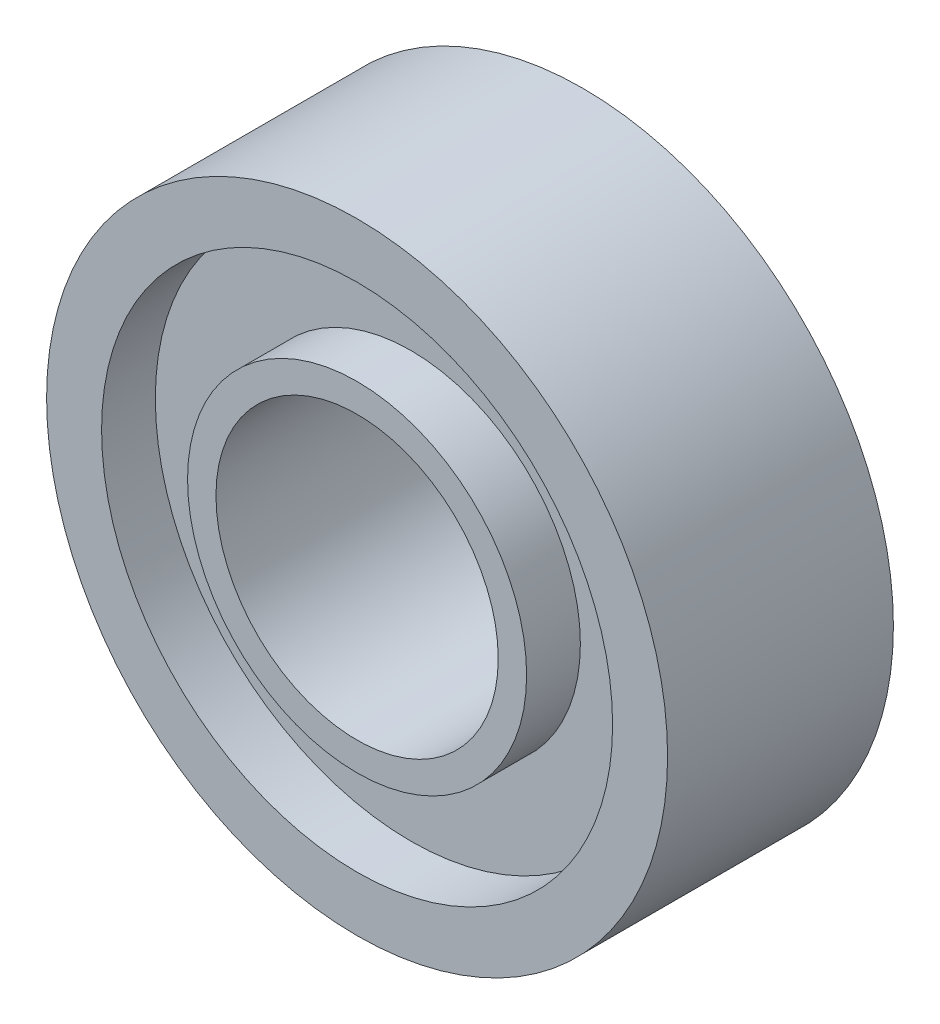
ISO-10303-21;
HEADER;
FILE_DESCRIPTION(('STEP AP214'),'2;1');
FILE_NAME('part.step','',(''),(''),'','','');
FILE_SCHEMA(('AUTOMOTIVE_DESIGN { 1 0 10303 214 1 1 1 1 }'));
ENDSEC;
DATA;
#1=APPLICATION_CONTEXT('core data for automotive mechanical design processes');
#2=APPLICATION_PROTOCOL_DEFINITION('international standard','automotive_design',2000,#1);
#3=PRODUCT_CONTEXT('',#1,'mechanical');
#4=PRODUCT('Part','Part','',(#3));
#5=PRODUCT_RELATED_PRODUCT_CATEGORY('part','',(#4));
#6=PRODUCT_DEFINITION_FORMATION('','',#4);
#7=PRODUCT_DEFINITION_CONTEXT('part definition',#1,'design');
#8=PRODUCT_DEFINITION('design','',#6,#7);
#9=PRODUCT_DEFINITION_SHAPE('','',#8);
#10=(LENGTH_UNIT() NAMED_UNIT(*) SI_UNIT(.MILLI.,.METRE.));
#11=(NAMED_UNIT(*) PLANE_ANGLE_UNIT() SI_UNIT($,.RADIAN.));
#12=(NAMED_UNIT(*) SI_UNIT($,.STERADIAN.) SOLID_ANGLE_UNIT());
#13=UNCERTAINTY_MEASURE_WITH_UNIT(LENGTH_MEASURE(1.E-05),#10,'distance_accuracy_value','');
#14=(GEOMETRIC_REPRESENTATION_CONTEXT(3) GLOBAL_UNCERTAINTY_ASSIGNED_CONTEXT((#13)) GLOBAL_UNIT_ASSIGNED_CONTEXT((#10,
#11,#12)) REPRESENTATION_CONTEXT('',''));
#15=CARTESIAN_POINT('',(0.,0.,0.));
#16=DIRECTION('',(0.,0.,1.));
#17=DIRECTION('',(1.,0.,0.));
#18=AXIS2_PLACEMENT_3D('',#15,#16,#17);
#19=CARTESIAN_POINT('',(0.,0.,2.));
#20=DIRECTION('',(0.,0.,1.));
#21=DIRECTION('',(1.,0.,0.));
#22=AXIS2_PLACEMENT_3D('',#19,#20,#21);
#23=PLANE('',#22);
#24=CARTESIAN_POINT('',(0.,0.,2.));
#25=DIRECTION('',(0.,0.,1.));
#26=DIRECTION('',(1.,0.,0.));
#27=AXIS2_PLACEMENT_3D('',#24,#25,#26);
#28=CIRCLE('',#27,2.5);
#29=CARTESIAN_POINT('',(2.5,0.,2.));
#30=VERTEX_POINT('',#29);
#31=EDGE_CURVE('E45',#30,#30,#28,.T.);
#32=ORIENTED_EDGE('',*,*,#31,.F.);
#33=EDGE_LOOP('',(#32));
#34=FACE_BOUND('',#33,.T.);
#35=CARTESIAN_POINT('',(0.,0.,2.));
#36=DIRECTION('',(0.,0.,1.));
#37=DIRECTION('',(1.,0.,0.));
#38=AXIS2_PLACEMENT_3D('',#35,#36,#37);
#39=CIRCLE('',#38,3.00299022562611);
#40=CARTESIAN_POINT('',(3.00299022562611,0.,2.));
#41=VERTEX_POINT('',#40);
#42=EDGE_CURVE('E62',#41,#41,#39,.T.);
#43=ORIENTED_EDGE('',*,*,#42,.T.);
#44=EDGE_LOOP('',(#43));
#45=FACE_BOUND('',#44,.T.);
#46=ADVANCED_FACE('F37',(#34,#45),#23,.T.);
#47=CARTESIAN_POINT('',(0.,0.,2.));
#48=DIRECTION('',(0.,0.,1.));
#49=DIRECTION('',(1.,0.,0.));
#50=AXIS2_PLACEMENT_3D('',#47,#48,#49);
#51=CIRCLE('',#50,4.52605772452427);
#52=CARTESIAN_POINT('',(4.52605772452427,0.,2.));
#53=VERTEX_POINT('',#52);
#54=EDGE_CURVE('E55',#53,#53,#51,.T.);
#55=ORIENTED_EDGE('',*,*,#54,.F.);
#56=EDGE_LOOP('',(#55));
#57=FACE_BOUND('',#56,.T.);
#58=CARTESIAN_POINT('',(0.,0.,2.));
#59=DIRECTION('',(0.,0.,1.));
#60=DIRECTION('',(1.,0.,0.));
#61=AXIS2_PLACEMENT_3D('',#58,#59,#60);
#62=CIRCLE('',#61,5.5);
#63=CARTESIAN_POINT('',(5.5,0.,2.));
#64=VERTEX_POINT('',#63);
#65=EDGE_CURVE('E10',#64,#64,#62,.T.);
#66=ORIENTED_EDGE('',*,*,#65,.T.);
#67=EDGE_LOOP('',(#66));
#68=FACE_BOUND('',#67,.T.);
#69=ADVANCED_FACE('F120',(#57,#68),#23,.T.);
#70=CARTESIAN_POINT('',(0.,0.,2.));
#71=DIRECTION('',(0.,0.,-1.));
#72=DIRECTION('',(-1.,0.,0.));
#73=AXIS2_PLACEMENT_3D('',#70,#71,#72);
#74=CYLINDRICAL_SURFACE('',#73,5.5);
#75=ORIENTED_EDGE('',*,*,#65,.F.);
#76=EDGE_LOOP('',(#75));
#77=FACE_BOUND('',#76,.T.);
#78=CARTESIAN_POINT('',(0.,0.,-2.));
#79=DIRECTION('',(0.,0.,1.));
#80=DIRECTION('',(1.,0.,0.));
#81=AXIS2_PLACEMENT_3D('',#78,#79,#80);
#82=CIRCLE('',#81,5.5);
#83=CARTESIAN_POINT('',(5.5,0.,-2.));
#84=VERTEX_POINT('',#83);
#85=EDGE_CURVE('E66',#84,#84,#82,.T.);
#86=ORIENTED_EDGE('',*,*,#85,.T.);
#87=EDGE_LOOP('',(#86));
#88=FACE_BOUND('',#87,.T.);
#89=ADVANCED_FACE('F39',(#77,#88),#74,.T.);
#90=CARTESIAN_POINT('',(0.,0.,2.));
#91=DIRECTION('',(0.,0.,-1.));
#92=DIRECTION('',(-1.,0.,0.));
#93=AXIS2_PLACEMENT_3D('',#90,#91,#92);
#94=CYLINDRICAL_SURFACE('',#93,2.5);
#95=ORIENTED_EDGE('',*,*,#31,.T.);
#96=EDGE_LOOP('',(#95));
#97=FACE_BOUND('',#96,.T.);
#98=CARTESIAN_POINT('',(0.,0.,-2.));
#99=DIRECTION('',(0.,0.,1.));
#100=DIRECTION('',(1.,0.,0.));
#101=AXIS2_PLACEMENT_3D('',#98,#99,#100);
#102=CIRCLE('',#101,2.5);
#103=CARTESIAN_POINT('',(2.5,0.,-2.));
#104=VERTEX_POINT('',#103);
#105=EDGE_CURVE('E73',#104,#104,#102,.T.);
#106=ORIENTED_EDGE('',*,*,#105,.F.);
#107=EDGE_LOOP('',(#106));
#108=FACE_BOUND('',#107,.T.);
#109=ADVANCED_FACE('F128',(#97,#108),#94,.F.);
#110=CARTESIAN_POINT('',(0.,0.,1.048));
#111=DIRECTION('',(0.,0.,1.));
#112=DIRECTION('',(1.,0.,0.));
#113=AXIS2_PLACEMENT_3D('',#110,#111,#112);
#114=CYLINDRICAL_SURFACE('',#113,4.52605772452427);
#115=CARTESIAN_POINT('',(0.,0.,1.048));
#116=DIRECTION('',(0.,0.,1.));
#117=DIRECTION('',(1.,0.,0.));
#118=AXIS2_PLACEMENT_3D('',#115,#116,#117);
#119=CIRCLE('',#118,4.52605772452427);
#120=CARTESIAN_POINT('',(4.52605772452427,0.,1.048));
#121=VERTEX_POINT('',#120);
#122=EDGE_CURVE('E50',#121,#121,#119,.T.);
#123=ORIENTED_EDGE('',*,*,#122,.F.);
#124=EDGE_LOOP('',(#123));
#125=FACE_BOUND('',#124,.T.);
#126=ORIENTED_EDGE('',*,*,#54,.T.);
#127=EDGE_LOOP('',(#126));
#128=FACE_BOUND('',#127,.T.);
#129=ADVANCED_FACE('F131',(#125,#128),#114,.F.);
#130=CARTESIAN_POINT('',(0.,0.,1.048));
#131=DIRECTION('',(0.,0.,1.));
#132=DIRECTION('',(1.,0.,0.));
#133=AXIS2_PLACEMENT_3D('',#130,#131,#132);
#134=PLANE('',#133);
#135=CARTESIAN_POINT('',(0.,0.,1.048));
#136=DIRECTION('',(0.,0.,1.));
#137=DIRECTION('',(1.,0.,0.));
#138=AXIS2_PLACEMENT_3D('',#135,#136,#137);
#139=CIRCLE('',#138,3.00299022562611);
#140=CARTESIAN_POINT('',(3.00299022562611,0.,1.048));
#141=VERTEX_POINT('',#140);
#142=EDGE_CURVE('E60',#141,#141,#139,.T.);
#143=ORIENTED_EDGE('',*,*,#142,.F.);
#144=EDGE_LOOP('',(#143));
#145=FACE_BOUND('',#144,.T.);
#146=ORIENTED_EDGE('',*,*,#122,.T.);
#147=EDGE_LOOP('',(#146));
#148=FACE_BOUND('',#147,.T.);
#149=ADVANCED_FACE('F115',(#145,#148),#134,.T.);
#150=CARTESIAN_POINT('',(0.,0.,1.048));
#151=DIRECTION('',(0.,0.,1.));
#152=DIRECTION('',(1.,0.,0.));
#153=AXIS2_PLACEMENT_3D('',#150,#151,#152);
#154=CYLINDRICAL_SURFACE('',#153,3.00299022562611);
#155=ORIENTED_EDGE('',*,*,#142,.T.);
#156=EDGE_LOOP('',(#155));
#157=FACE_BOUND('',#156,.T.);
#158=ORIENTED_EDGE('',*,*,#42,.F.);
#159=EDGE_LOOP('',(#158));
#160=FACE_BOUND('',#159,.T.);
#161=ADVANCED_FACE('F106',(#157,#160),#154,.T.);
#162=CARTESIAN_POINT('',(0.,0.,-2.));
#163=DIRECTION('',(0.,0.,-1.));
#164=DIRECTION('',(1.,0.,0.));
#165=AXIS2_PLACEMENT_3D('',#162,#163,#164);
#166=PLANE('',#165);
#167=ORIENTED_EDGE('',*,*,#105,.T.);
#168=EDGE_LOOP('',(#167));
#169=FACE_BOUND('',#168,.T.);
#170=CARTESIAN_POINT('',(0.,0.,-2.));
#171=DIRECTION('',(0.,0.,1.));
#172=DIRECTION('',(1.,0.,0.));
#173=AXIS2_PLACEMENT_3D('',#170,#171,#172);
#174=CIRCLE('',#173,3.00299022562611);
#175=CARTESIAN_POINT('',(3.00299022562611,0.,-2.));
#176=VERTEX_POINT('',#175);
#177=EDGE_CURVE('E86',#176,#176,#174,.T.);
#178=ORIENTED_EDGE('',*,*,#177,.F.);
#179=EDGE_LOOP('',(#178));
#180=FACE_BOUND('',#179,.T.);
#181=ADVANCED_FACE('F103',(#169,#180),#166,.T.);
#182=CARTESIAN_POINT('',(0.,0.,-2.));
#183=DIRECTION('',(0.,0.,1.));
#184=DIRECTION('',(1.,0.,0.));
#185=AXIS2_PLACEMENT_3D('',#182,#183,#184);
#186=CIRCLE('',#185,4.52605772452427);
#187=CARTESIAN_POINT('',(4.52605772452427,0.,-2.));
#188=VERTEX_POINT('',#187);
#189=EDGE_CURVE('E78',#188,#188,#186,.T.);
#190=ORIENTED_EDGE('',*,*,#189,.T.);
#191=EDGE_LOOP('',(#190));
#192=FACE_BOUND('',#191,.T.);
#193=ORIENTED_EDGE('',*,*,#85,.F.);
#194=EDGE_LOOP('',(#193));
#195=FACE_BOUND('',#194,.T.);
#196=ADVANCED_FACE('F105',(#192,#195),#166,.T.);
#197=CARTESIAN_POINT('',(0.,0.,-1.048));
#198=DIRECTION('',(0.,0.,-1.));
#199=DIRECTION('',(1.,0.,0.));
#200=AXIS2_PLACEMENT_3D('',#197,#198,#199);
#201=CYLINDRICAL_SURFACE('',#200,4.52605772452427);
#202=CARTESIAN_POINT('',(0.,0.,-1.048));
#203=DIRECTION('',(0.,0.,1.));
#204=DIRECTION('',(1.,0.,0.));
#205=AXIS2_PLACEMENT_3D('',#202,#203,#204);
#206=CIRCLE('',#205,4.52605772452427);
#207=CARTESIAN_POINT('',(4.52605772452427,0.,-1.048));
#208=VERTEX_POINT('',#207);
#209=EDGE_CURVE('E77',#208,#208,#206,.T.);
#210=ORIENTED_EDGE('',*,*,#209,.T.);
#211=EDGE_LOOP('',(#210));
#212=FACE_BOUND('',#211,.T.);
#213=ORIENTED_EDGE('',*,*,#189,.F.);
#214=EDGE_LOOP('',(#213));
#215=FACE_BOUND('',#214,.T.);
#216=ADVANCED_FACE('F113',(#212,#215),#201,.F.);
#217=CARTESIAN_POINT('',(0.,0.,-1.048));
#218=DIRECTION('',(0.,0.,-1.));
#219=DIRECTION('',(1.,0.,0.));
#220=AXIS2_PLACEMENT_3D('',#217,#218,#219);
#221=PLANE('',#220);
#222=CARTESIAN_POINT('',(0.,0.,-1.048));
#223=DIRECTION('',(0.,0.,1.));
#224=DIRECTION('',(1.,0.,0.));
#225=AXIS2_PLACEMENT_3D('',#222,#223,#224);
#226=CIRCLE('',#225,3.00299022562611);
#227=CARTESIAN_POINT('',(3.00299022562611,0.,-1.048));
#228=VERTEX_POINT('',#227);
#229=EDGE_CURVE('E82',#228,#228,#226,.T.);
#230=ORIENTED_EDGE('',*,*,#229,.T.);
#231=EDGE_LOOP('',(#230));
#232=FACE_BOUND('',#231,.T.);
#233=ORIENTED_EDGE('',*,*,#209,.F.);
#234=EDGE_LOOP('',(#233));
#235=FACE_BOUND('',#234,.T.);
#236=ADVANCED_FACE('F94',(#232,#235),#221,.T.);
#237=CARTESIAN_POINT('',(0.,0.,-1.048));
#238=DIRECTION('',(0.,0.,-1.));
#239=DIRECTION('',(1.,0.,0.));
#240=AXIS2_PLACEMENT_3D('',#237,#238,#239);
#241=CYLINDRICAL_SURFACE('',#240,3.00299022562611);
#242=ORIENTED_EDGE('',*,*,#229,.F.);
#243=EDGE_LOOP('',(#242));
#244=FACE_BOUND('',#243,.T.);
#245=ORIENTED_EDGE('',*,*,#177,.T.);
#246=EDGE_LOOP('',(#245));
#247=FACE_BOUND('',#246,.T.);
#248=ADVANCED_FACE('F97',(#244,#247),#241,.T.);
#249=CLOSED_SHELL('',(#46,#69,#89,#109,#129,#149,#161,#181,#196,#216,#236,#248));
#250=MANIFOLD_SOLID_BREP('B2',#249);
#251=ADVANCED_BREP_SHAPE_REPRESENTATION('',(#18,#250),#14);
#252=SHAPE_DEFINITION_REPRESENTATION(#9,#251);
ENDSEC;
END-ISO-10303-21;
